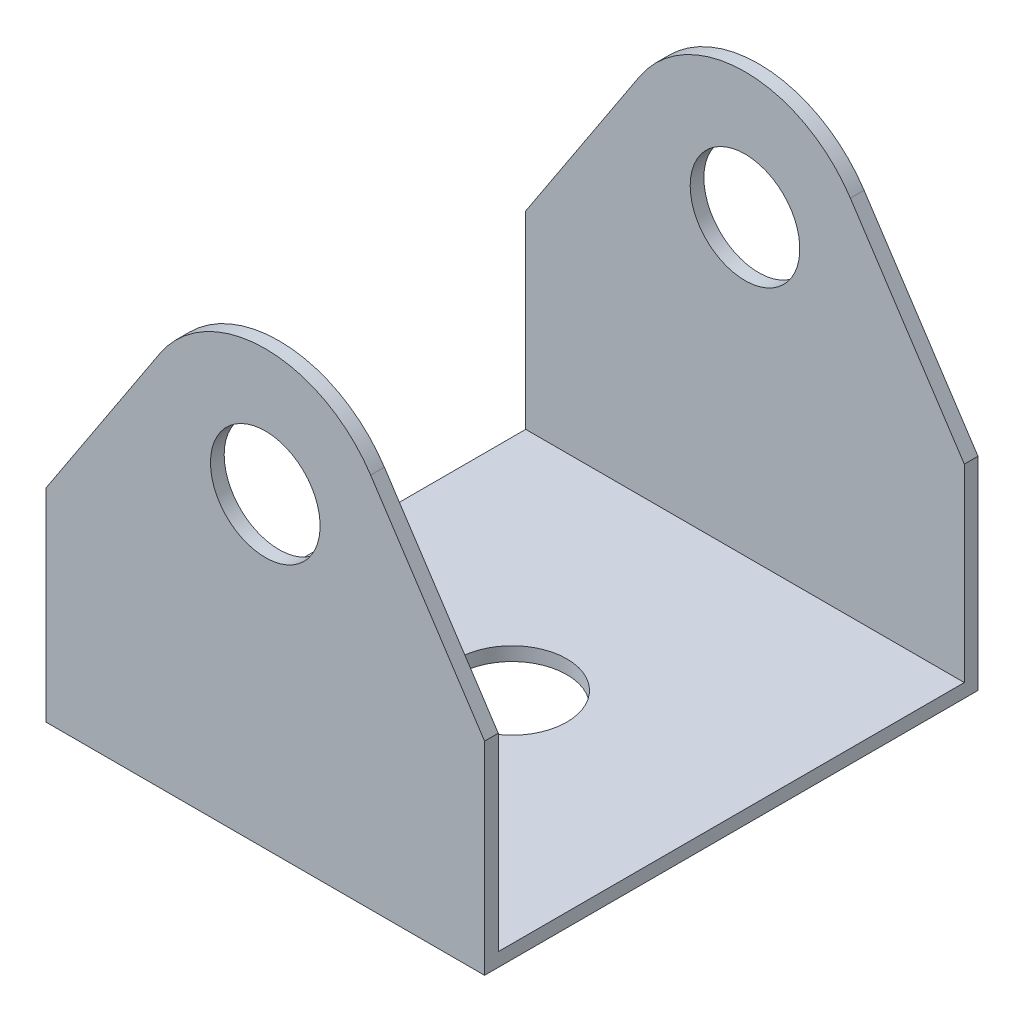
ISO-10303-21;
HEADER;
FILE_DESCRIPTION(('STEP AP214'),'2;1');
FILE_NAME('part.step','',(''),(''),'','','');
FILE_SCHEMA(('AUTOMOTIVE_DESIGN { 1 0 10303 214 1 1 1 1 }'));
ENDSEC;
DATA;
#1=APPLICATION_CONTEXT('core data for automotive mechanical design processes');
#2=APPLICATION_PROTOCOL_DEFINITION('international standard','automotive_design',2000,#1);
#3=PRODUCT_CONTEXT('',#1,'mechanical');
#4=PRODUCT('Part','Part','',(#3));
#5=PRODUCT_RELATED_PRODUCT_CATEGORY('part','',(#4));
#6=PRODUCT_DEFINITION_FORMATION('','',#4);
#7=PRODUCT_DEFINITION_CONTEXT('part definition',#1,'design');
#8=PRODUCT_DEFINITION('design','',#6,#7);
#9=PRODUCT_DEFINITION_SHAPE('','',#8);
#10=(LENGTH_UNIT() NAMED_UNIT(*) SI_UNIT(.MILLI.,.METRE.));
#11=(NAMED_UNIT(*) PLANE_ANGLE_UNIT() SI_UNIT($,.RADIAN.));
#12=(NAMED_UNIT(*) SI_UNIT($,.STERADIAN.) SOLID_ANGLE_UNIT());
#13=UNCERTAINTY_MEASURE_WITH_UNIT(LENGTH_MEASURE(1.E-05),#10,'distance_accuracy_value','');
#14=(GEOMETRIC_REPRESENTATION_CONTEXT(3) GLOBAL_UNCERTAINTY_ASSIGNED_CONTEXT((#13)) GLOBAL_UNIT_ASSIGNED_CONTEXT((#10,
#11,#12)) REPRESENTATION_CONTEXT('',''));
#15=CARTESIAN_POINT('',(0.,0.,0.));
#16=DIRECTION('',(0.,0.,1.));
#17=DIRECTION('',(1.,0.,0.));
#18=AXIS2_PLACEMENT_3D('',#15,#16,#17);
#19=CARTESIAN_POINT('',(40.,-19.,90.));
#20=DIRECTION('',(-0.835794870617099,-0.549041832878103,0.));
#21=DIRECTION('',(0.549041832878103,-0.835794870617099,0.));
#22=AXIS2_PLACEMENT_3D('',#19,#20,#21);
#23=PLANE('',#22);
#24=DIRECTION('',(-0.549041832878103,0.835794870617099,0.));
#25=VECTOR('',#24,1.);
#26=CARTESIAN_POINT('',(40.,-19.,2.5));
#27=LINE('',#26,#25);
#28=CARTESIAN_POINT('',(40.,-19.,2.5));
#29=VERTEX_POINT('',#28);
#30=CARTESIAN_POINT('',(19.2232820241933,12.6279621561964,2.5));
#31=VERTEX_POINT('',#30);
#32=EDGE_CURVE('E152',#29,#31,#27,.T.);
#33=ORIENTED_EDGE('',*,*,#32,.F.);
#34=DIRECTION('',(0.,0.,-1.));
#35=VECTOR('',#34,1.);
#36=CARTESIAN_POINT('',(40.,-19.,90.));
#37=LINE('',#36,#35);
#38=CARTESIAN_POINT('',(40.,-19.,0.));
#39=VERTEX_POINT('',#38);
#40=EDGE_CURVE('E144',#29,#39,#37,.T.);
#41=ORIENTED_EDGE('',*,*,#40,.T.);
#42=DIRECTION('',(-0.549041832878103,0.835794870617099,0.));
#43=VECTOR('',#42,1.);
#44=CARTESIAN_POINT('',(40.,-19.,0.));
#45=LINE('',#44,#43);
#46=CARTESIAN_POINT('',(19.2232820241933,12.6279621561964,0.));
#47=VERTEX_POINT('',#46);
#48=EDGE_CURVE('E161',#39,#47,#45,.T.);
#49=ORIENTED_EDGE('',*,*,#48,.T.);
#50=DIRECTION('',(0.,0.,-1.));
#51=VECTOR('',#50,1.);
#52=CARTESIAN_POINT('',(19.2232820241933,12.6279621561964,90.));
#53=LINE('',#52,#51);
#54=EDGE_CURVE('E40',#31,#47,#53,.T.);
#55=ORIENTED_EDGE('',*,*,#54,.F.);
#56=EDGE_LOOP('',(#33,#41,#49,#55));
#57=FACE_BOUND('',#56,.T.);
#58=ADVANCED_FACE('F31',(#57),#23,.F.);
#59=CARTESIAN_POINT('',(0.,0.,90.));
#60=DIRECTION('',(0.,0.,-1.));
#61=DIRECTION('',(-1.,0.,0.));
#62=AXIS2_PLACEMENT_3D('',#59,#60,#61);
#63=CYLINDRICAL_SURFACE('',#62,23.);
#64=CARTESIAN_POINT('',(0.,0.,2.5));
#65=DIRECTION('',(0.,0.,1.));
#66=DIRECTION('',(1.,0.,0.));
#67=AXIS2_PLACEMENT_3D('',#64,#65,#66);
#68=CIRCLE('',#67,23.);
#69=CARTESIAN_POINT('',(-19.2232820241933,12.6279621561964,2.5));
#70=VERTEX_POINT('',#69);
#71=EDGE_CURVE('E154',#31,#70,#68,.T.);
#72=ORIENTED_EDGE('',*,*,#71,.F.);
#73=ORIENTED_EDGE('',*,*,#54,.T.);
#74=CARTESIAN_POINT('',(0.,0.,0.));
#75=DIRECTION('',(0.,0.,1.));
#76=DIRECTION('',(1.,0.,0.));
#77=AXIS2_PLACEMENT_3D('',#74,#75,#76);
#78=CIRCLE('',#77,23.);
#79=CARTESIAN_POINT('',(-19.2232820241933,12.6279621561964,0.));
#80=VERTEX_POINT('',#79);
#81=EDGE_CURVE('E173',#47,#80,#78,.T.);
#82=ORIENTED_EDGE('',*,*,#81,.T.);
#83=DIRECTION('',(0.,0.,-1.));
#84=VECTOR('',#83,1.);
#85=CARTESIAN_POINT('',(-19.2232820241933,12.6279621561964,90.));
#86=LINE('',#85,#84);
#87=EDGE_CURVE('E209',#70,#80,#86,.T.);
#88=ORIENTED_EDGE('',*,*,#87,.F.);
#89=EDGE_LOOP('',(#72,#73,#82,#88));
#90=FACE_BOUND('',#89,.T.);
#91=ADVANCED_FACE('F261',(#90),#63,.T.);
#92=CARTESIAN_POINT('',(-40.,-19.,90.));
#93=DIRECTION('',(0.835794870617099,-0.549041832878103,0.));
#94=DIRECTION('',(0.549041832878103,0.835794870617099,0.));
#95=AXIS2_PLACEMENT_3D('',#92,#93,#94);
#96=PLANE('',#95);
#97=DIRECTION('',(-0.549041832878103,-0.835794870617099,0.));
#98=VECTOR('',#97,1.);
#99=CARTESIAN_POINT('',(-40.,-19.,2.5));
#100=LINE('',#99,#98);
#101=CARTESIAN_POINT('',(-40.,-19.,2.5));
#102=VERTEX_POINT('',#101);
#103=EDGE_CURVE('E157',#70,#102,#100,.T.);
#104=ORIENTED_EDGE('',*,*,#103,.F.);
#105=ORIENTED_EDGE('',*,*,#87,.T.);
#106=DIRECTION('',(-0.549041832878103,-0.835794870617099,0.));
#107=VECTOR('',#106,1.);
#108=CARTESIAN_POINT('',(-40.,-19.,0.));
#109=LINE('',#108,#107);
#110=CARTESIAN_POINT('',(-40.,-19.,0.));
#111=VERTEX_POINT('',#110);
#112=EDGE_CURVE('E176',#80,#111,#109,.T.);
#113=ORIENTED_EDGE('',*,*,#112,.T.);
#114=DIRECTION('',(0.,0.,-1.));
#115=VECTOR('',#114,1.);
#116=CARTESIAN_POINT('',(-40.,-19.,90.));
#117=LINE('',#116,#115);
#118=EDGE_CURVE('E205',#102,#111,#117,.T.);
#119=ORIENTED_EDGE('',*,*,#118,.F.);
#120=EDGE_LOOP('',(#104,#105,#113,#119));
#121=FACE_BOUND('',#120,.T.);
#122=ADVANCED_FACE('F257',(#121),#96,.F.);
#123=CARTESIAN_POINT('',(-40.,-19.,90.));
#124=DIRECTION('',(1.,0.,0.));
#125=DIRECTION('',(0.,1.,0.));
#126=AXIS2_PLACEMENT_3D('',#123,#124,#125);
#127=PLANE('',#126);
#128=DIRECTION('',(0.,-1.,0.));
#129=VECTOR('',#128,1.);
#130=CARTESIAN_POINT('',(-40.,-19.,2.5));
#131=LINE('',#130,#129);
#132=CARTESIAN_POINT('',(-40.,-53.5,2.5));
#133=VERTEX_POINT('',#132);
#134=EDGE_CURVE('E130',#102,#133,#131,.T.);
#135=ORIENTED_EDGE('',*,*,#134,.F.);
#136=ORIENTED_EDGE('',*,*,#118,.T.);
#137=DIRECTION('',(0.,-1.,0.));
#138=VECTOR('',#137,1.);
#139=CARTESIAN_POINT('',(-40.,-19.,0.));
#140=LINE('',#139,#138);
#141=CARTESIAN_POINT('',(-40.,-56.,0.));
#142=VERTEX_POINT('',#141);
#143=EDGE_CURVE('E179',#111,#142,#140,.T.);
#144=ORIENTED_EDGE('',*,*,#143,.T.);
#145=DIRECTION('',(0.,0.,-1.));
#146=VECTOR('',#145,1.);
#147=CARTESIAN_POINT('',(-40.,-56.,90.));
#148=LINE('',#147,#146);
#149=CARTESIAN_POINT('',(-40.,-56.,90.));
#150=VERTEX_POINT('',#149);
#151=EDGE_CURVE('E202',#150,#142,#148,.T.);
#152=ORIENTED_EDGE('',*,*,#151,.F.);
#153=DIRECTION('',(0.,-1.,0.));
#154=VECTOR('',#153,1.);
#155=CARTESIAN_POINT('',(-40.,-19.,90.));
#156=LINE('',#155,#154);
#157=CARTESIAN_POINT('',(-40.,-19.,90.));
#158=VERTEX_POINT('',#157);
#159=EDGE_CURVE('E191',#158,#150,#156,.T.);
#160=ORIENTED_EDGE('',*,*,#159,.F.);
#161=CARTESIAN_POINT('',(-40.,-19.,87.5));
#162=VERTEX_POINT('',#161);
#163=EDGE_CURVE('E206',#158,#162,#117,.T.);
#164=ORIENTED_EDGE('',*,*,#163,.T.);
#165=DIRECTION('',(0.,-1.,0.));
#166=VECTOR('',#165,1.);
#167=CARTESIAN_POINT('',(-40.,-19.,87.5));
#168=LINE('',#167,#166);
#169=CARTESIAN_POINT('',(-40.,-53.5,87.5));
#170=VERTEX_POINT('',#169);
#171=EDGE_CURVE('E162',#162,#170,#168,.T.);
#172=ORIENTED_EDGE('',*,*,#171,.T.);
#173=DIRECTION('',(0.,0.,-1.));
#174=VECTOR('',#173,1.);
#175=CARTESIAN_POINT('',(-40.,-53.5,90.));
#176=LINE('',#175,#174);
#177=EDGE_CURVE('E139',#170,#133,#176,.T.);
#178=ORIENTED_EDGE('',*,*,#177,.T.);
#179=EDGE_LOOP('',(#135,#136,#144,#152,#160,#164,#172,#178));
#180=FACE_BOUND('',#179,.T.);
#181=ADVANCED_FACE('F252',(#180),#127,.F.);
#182=CARTESIAN_POINT('',(40.,-19.,90.));
#183=DIRECTION('',(-1.,0.,0.));
#184=DIRECTION('',(0.,-1.,0.));
#185=AXIS2_PLACEMENT_3D('',#182,#183,#184);
#186=PLANE('',#185);
#187=DIRECTION('',(0.,1.,0.));
#188=VECTOR('',#187,1.);
#189=CARTESIAN_POINT('',(40.,-19.,2.5));
#190=LINE('',#189,#188);
#191=CARTESIAN_POINT('',(40.,-53.5,2.5));
#192=VERTEX_POINT('',#191);
#193=EDGE_CURVE('E127',#192,#29,#190,.T.);
#194=ORIENTED_EDGE('',*,*,#193,.F.);
#195=DIRECTION('',(0.,0.,-1.));
#196=VECTOR('',#195,1.);
#197=CARTESIAN_POINT('',(40.,-53.5,90.));
#198=LINE('',#197,#196);
#199=CARTESIAN_POINT('',(40.,-53.5,87.5));
#200=VERTEX_POINT('',#199);
#201=EDGE_CURVE('E135',#200,#192,#198,.T.);
#202=ORIENTED_EDGE('',*,*,#201,.F.);
#203=DIRECTION('',(0.,1.,0.));
#204=VECTOR('',#203,1.);
#205=CARTESIAN_POINT('',(40.,-19.,87.5));
#206=LINE('',#205,#204);
#207=CARTESIAN_POINT('',(40.,-19.,87.5));
#208=VERTEX_POINT('',#207);
#209=EDGE_CURVE('E48',#200,#208,#206,.T.);
#210=ORIENTED_EDGE('',*,*,#209,.T.);
#211=CARTESIAN_POINT('',(40.,-19.,90.));
#212=VERTEX_POINT('',#211);
#213=EDGE_CURVE('E196',#212,#208,#37,.T.);
#214=ORIENTED_EDGE('',*,*,#213,.F.);
#215=DIRECTION('',(0.,1.,0.));
#216=VECTOR('',#215,1.);
#217=CARTESIAN_POINT('',(40.,-19.,90.));
#218=LINE('',#217,#216);
#219=CARTESIAN_POINT('',(40.,-56.,90.));
#220=VERTEX_POINT('',#219);
#221=EDGE_CURVE('E56',#220,#212,#218,.T.);
#222=ORIENTED_EDGE('',*,*,#221,.F.);
#223=DIRECTION('',(0.,0.,-1.));
#224=VECTOR('',#223,1.);
#225=CARTESIAN_POINT('',(40.,-56.,90.));
#226=LINE('',#225,#224);
#227=CARTESIAN_POINT('',(40.,-56.,0.));
#228=VERTEX_POINT('',#227);
#229=EDGE_CURVE('E199',#220,#228,#226,.T.);
#230=ORIENTED_EDGE('',*,*,#229,.T.);
#231=DIRECTION('',(0.,1.,0.));
#232=VECTOR('',#231,1.);
#233=CARTESIAN_POINT('',(40.,-19.,0.));
#234=LINE('',#233,#232);
#235=EDGE_CURVE('E183',#228,#39,#234,.T.);
#236=ORIENTED_EDGE('',*,*,#235,.T.);
#237=ORIENTED_EDGE('',*,*,#40,.F.);
#238=EDGE_LOOP('',(#194,#202,#210,#214,#222,#230,#236,#237));
#239=FACE_BOUND('',#238,.T.);
#240=ADVANCED_FACE('F142',(#239),#186,.F.);
#241=ORIENTED_EDGE('',*,*,#213,.T.);
#242=DIRECTION('',(-0.549041832878103,0.835794870617099,0.));
#243=VECTOR('',#242,1.);
#244=CARTESIAN_POINT('',(40.,-19.,87.5));
#245=LINE('',#244,#243);
#246=CARTESIAN_POINT('',(19.2232820241933,12.6279621561964,87.5));
#247=VERTEX_POINT('',#246);
#248=EDGE_CURVE('E145',#208,#247,#245,.T.);
#249=ORIENTED_EDGE('',*,*,#248,.T.);
#250=CARTESIAN_POINT('',(19.2232820241933,12.6279621561964,90.));
#251=VERTEX_POINT('',#250);
#252=EDGE_CURVE('E11',#251,#247,#53,.T.);
#253=ORIENTED_EDGE('',*,*,#252,.F.);
#254=DIRECTION('',(-0.549041832878103,0.835794870617099,0.));
#255=VECTOR('',#254,1.);
#256=CARTESIAN_POINT('',(40.,-19.,90.));
#257=LINE('',#256,#255);
#258=EDGE_CURVE('E185',#212,#251,#257,.T.);
#259=ORIENTED_EDGE('',*,*,#258,.F.);
#260=EDGE_LOOP('',(#241,#249,#253,#259));
#261=FACE_BOUND('',#260,.T.);
#262=ADVANCED_FACE('F33',(#261),#23,.F.);
#263=ORIENTED_EDGE('',*,*,#252,.T.);
#264=CARTESIAN_POINT('',(0.,0.,87.5));
#265=DIRECTION('',(0.,0.,1.));
#266=DIRECTION('',(1.,0.,0.));
#267=AXIS2_PLACEMENT_3D('',#264,#265,#266);
#268=CIRCLE('',#267,23.);
#269=CARTESIAN_POINT('',(-19.2232820241933,12.6279621561964,87.5));
#270=VERTEX_POINT('',#269);
#271=EDGE_CURVE('E148',#247,#270,#268,.T.);
#272=ORIENTED_EDGE('',*,*,#271,.T.);
#273=CARTESIAN_POINT('',(-19.2232820241933,12.6279621561964,90.));
#274=VERTEX_POINT('',#273);
#275=EDGE_CURVE('E210',#274,#270,#86,.T.);
#276=ORIENTED_EDGE('',*,*,#275,.F.);
#277=CARTESIAN_POINT('',(0.,0.,90.));
#278=DIRECTION('',(0.,0.,1.));
#279=DIRECTION('',(1.,0.,0.));
#280=AXIS2_PLACEMENT_3D('',#277,#278,#279);
#281=CIRCLE('',#280,23.);
#282=EDGE_CURVE('E187',#251,#274,#281,.T.);
#283=ORIENTED_EDGE('',*,*,#282,.F.);
#284=EDGE_LOOP('',(#263,#272,#276,#283));
#285=FACE_BOUND('',#284,.T.);
#286=ADVANCED_FACE('F263',(#285),#63,.T.);
#287=ORIENTED_EDGE('',*,*,#275,.T.);
#288=DIRECTION('',(-0.549041832878103,-0.835794870617099,0.));
#289=VECTOR('',#288,1.);
#290=CARTESIAN_POINT('',(-40.,-19.,87.5));
#291=LINE('',#290,#289);
#292=EDGE_CURVE('E165',#270,#162,#291,.T.);
#293=ORIENTED_EDGE('',*,*,#292,.T.);
#294=ORIENTED_EDGE('',*,*,#163,.F.);
#295=DIRECTION('',(-0.549041832878103,-0.835794870617099,0.));
#296=VECTOR('',#295,1.);
#297=CARTESIAN_POINT('',(-40.,-19.,90.));
#298=LINE('',#297,#296);
#299=EDGE_CURVE('E189',#274,#158,#298,.T.);
#300=ORIENTED_EDGE('',*,*,#299,.F.);
#301=EDGE_LOOP('',(#287,#293,#294,#300));
#302=FACE_BOUND('',#301,.T.);
#303=ADVANCED_FACE('F269',(#302),#96,.F.);
#304=CARTESIAN_POINT('',(40.,-56.,90.));
#305=DIRECTION('',(0.,1.,0.));
#306=DIRECTION('',(0.,0.,1.));
#307=AXIS2_PLACEMENT_3D('',#304,#305,#306);
#308=PLANE('',#307);
#309=CARTESIAN_POINT('',(0.,-56.,45.));
#310=DIRECTION('',(0.,-1.,0.));
#311=DIRECTION('',(0.,0.,-1.));
#312=AXIS2_PLACEMENT_3D('',#309,#310,#311);
#313=CIRCLE('',#312,10.);
#314=CARTESIAN_POINT('',(0.,-56.,35.));
#315=VERTEX_POINT('',#314);
#316=EDGE_CURVE('E213',#315,#315,#313,.T.);
#317=ORIENTED_EDGE('',*,*,#316,.F.);
#318=EDGE_LOOP('',(#317));
#319=FACE_BOUND('',#318,.T.);
#320=DIRECTION('',(1.,0.,0.));
#321=VECTOR('',#320,1.);
#322=CARTESIAN_POINT('',(40.,-56.,0.));
#323=LINE('',#322,#321);
#324=EDGE_CURVE('E181',#142,#228,#323,.T.);
#325=ORIENTED_EDGE('',*,*,#324,.T.);
#326=ORIENTED_EDGE('',*,*,#229,.F.);
#327=DIRECTION('',(1.,0.,0.));
#328=VECTOR('',#327,1.);
#329=CARTESIAN_POINT('',(40.,-56.,90.));
#330=LINE('',#329,#328);
#331=EDGE_CURVE('E193',#150,#220,#330,.T.);
#332=ORIENTED_EDGE('',*,*,#331,.F.);
#333=ORIENTED_EDGE('',*,*,#151,.T.);
#334=EDGE_LOOP('',(#325,#326,#332,#333));
#335=FACE_BOUND('',#334,.T.);
#336=ADVANCED_FACE('F248',(#319,#335),#308,.F.);
#337=CARTESIAN_POINT('',(0.,0.,90.));
#338=DIRECTION('',(0.,0.,1.));
#339=DIRECTION('',(1.,0.,0.));
#340=AXIS2_PLACEMENT_3D('',#337,#338,#339);
#341=PLANE('',#340);
#342=CARTESIAN_POINT('',(0.,0.,90.));
#343=DIRECTION('',(0.,0.,-1.));
#344=DIRECTION('',(-1.,0.,0.));
#345=AXIS2_PLACEMENT_3D('',#342,#343,#344);
#346=CIRCLE('',#345,10.);
#347=CARTESIAN_POINT('',(-10.,0.,90.));
#348=VERTEX_POINT('',#347);
#349=EDGE_CURVE('E224',#348,#348,#346,.T.);
#350=ORIENTED_EDGE('',*,*,#349,.T.);
#351=EDGE_LOOP('',(#350));
#352=FACE_BOUND('',#351,.T.);
#353=ORIENTED_EDGE('',*,*,#258,.T.);
#354=ORIENTED_EDGE('',*,*,#282,.T.);
#355=ORIENTED_EDGE('',*,*,#299,.T.);
#356=ORIENTED_EDGE('',*,*,#159,.T.);
#357=ORIENTED_EDGE('',*,*,#331,.T.);
#358=ORIENTED_EDGE('',*,*,#221,.T.);
#359=EDGE_LOOP('',(#353,#354,#355,#356,#357,#358));
#360=FACE_BOUND('',#359,.T.);
#361=ADVANCED_FACE('F236',(#352,#360),#341,.T.);
#362=CARTESIAN_POINT('',(0.,0.,0.));
#363=DIRECTION('',(0.,0.,1.));
#364=DIRECTION('',(1.,0.,0.));
#365=AXIS2_PLACEMENT_3D('',#362,#363,#364);
#366=PLANE('',#365);
#367=CARTESIAN_POINT('',(0.,0.,0.));
#368=DIRECTION('',(0.,0.,-1.));
#369=DIRECTION('',(-1.,0.,0.));
#370=AXIS2_PLACEMENT_3D('',#367,#368,#369);
#371=CIRCLE('',#370,10.);
#372=CARTESIAN_POINT('',(-10.,0.,0.));
#373=VERTEX_POINT('',#372);
#374=EDGE_CURVE('E227',#373,#373,#371,.T.);
#375=ORIENTED_EDGE('',*,*,#374,.F.);
#376=EDGE_LOOP('',(#375));
#377=FACE_BOUND('',#376,.T.);
#378=ORIENTED_EDGE('',*,*,#48,.F.);
#379=ORIENTED_EDGE('',*,*,#235,.F.);
#380=ORIENTED_EDGE('',*,*,#324,.F.);
#381=ORIENTED_EDGE('',*,*,#143,.F.);
#382=ORIENTED_EDGE('',*,*,#112,.F.);
#383=ORIENTED_EDGE('',*,*,#81,.F.);
#384=EDGE_LOOP('',(#378,#379,#380,#381,#382,#383));
#385=FACE_BOUND('',#384,.T.);
#386=ADVANCED_FACE('F233',(#377,#385),#366,.F.);
#387=CARTESIAN_POINT('',(40.,-53.5,90.));
#388=DIRECTION('',(0.,1.,0.));
#389=DIRECTION('',(0.,0.,1.));
#390=AXIS2_PLACEMENT_3D('',#387,#388,#389);
#391=PLANE('',#390);
#392=CARTESIAN_POINT('',(0.,-53.5,45.));
#393=DIRECTION('',(0.,1.,0.));
#394=DIRECTION('',(0.,0.,1.));
#395=AXIS2_PLACEMENT_3D('',#392,#393,#394);
#396=CIRCLE('',#395,10.);
#397=CARTESIAN_POINT('',(0.,-53.5,35.));
#398=VERTEX_POINT('',#397);
#399=EDGE_CURVE('E155',#398,#398,#396,.T.);
#400=ORIENTED_EDGE('',*,*,#399,.F.);
#401=EDGE_LOOP('',(#400));
#402=FACE_BOUND('',#401,.T.);
#403=DIRECTION('',(1.,0.,0.));
#404=VECTOR('',#403,1.);
#405=CARTESIAN_POINT('',(40.,-53.5,2.5));
#406=LINE('',#405,#404);
#407=EDGE_CURVE('E123',#133,#192,#406,.T.);
#408=ORIENTED_EDGE('',*,*,#407,.F.);
#409=ORIENTED_EDGE('',*,*,#177,.F.);
#410=DIRECTION('',(1.,0.,0.));
#411=VECTOR('',#410,1.);
#412=CARTESIAN_POINT('',(40.,-53.5,87.5));
#413=LINE('',#412,#411);
#414=EDGE_CURVE('E137',#170,#200,#413,.T.);
#415=ORIENTED_EDGE('',*,*,#414,.T.);
#416=ORIENTED_EDGE('',*,*,#201,.T.);
#417=EDGE_LOOP('',(#408,#409,#415,#416));
#418=FACE_BOUND('',#417,.T.);
#419=ADVANCED_FACE('F136',(#402,#418),#391,.T.);
#420=CARTESIAN_POINT('',(0.,0.,87.5));
#421=DIRECTION('',(0.,0.,1.));
#422=DIRECTION('',(1.,0.,0.));
#423=AXIS2_PLACEMENT_3D('',#420,#421,#422);
#424=PLANE('',#423);
#425=CARTESIAN_POINT('',(0.,0.,87.5));
#426=DIRECTION('',(0.,0.,1.));
#427=DIRECTION('',(1.,0.,0.));
#428=AXIS2_PLACEMENT_3D('',#425,#426,#427);
#429=CIRCLE('',#428,10.);
#430=CARTESIAN_POINT('',(-10.,0.,87.5));
#431=VERTEX_POINT('',#430);
#432=EDGE_CURVE('E217',#431,#431,#429,.T.);
#433=ORIENTED_EDGE('',*,*,#432,.T.);
#434=EDGE_LOOP('',(#433));
#435=FACE_BOUND('',#434,.T.);
#436=ORIENTED_EDGE('',*,*,#248,.F.);
#437=ORIENTED_EDGE('',*,*,#209,.F.);
#438=ORIENTED_EDGE('',*,*,#414,.F.);
#439=ORIENTED_EDGE('',*,*,#171,.F.);
#440=ORIENTED_EDGE('',*,*,#292,.F.);
#441=ORIENTED_EDGE('',*,*,#271,.F.);
#442=EDGE_LOOP('',(#436,#437,#438,#439,#440,#441));
#443=FACE_BOUND('',#442,.T.);
#444=ADVANCED_FACE('F281',(#435,#443),#424,.F.);
#445=CARTESIAN_POINT('',(0.,0.,2.5));
#446=DIRECTION('',(0.,0.,1.));
#447=DIRECTION('',(1.,0.,0.));
#448=AXIS2_PLACEMENT_3D('',#445,#446,#447);
#449=PLANE('',#448);
#450=CARTESIAN_POINT('',(0.,0.,2.5));
#451=DIRECTION('',(0.,0.,1.));
#452=DIRECTION('',(1.,0.,0.));
#453=AXIS2_PLACEMENT_3D('',#450,#451,#452);
#454=CIRCLE('',#453,10.);
#455=CARTESIAN_POINT('',(-10.,0.,2.49999999999999));
#456=VERTEX_POINT('',#455);
#457=EDGE_CURVE('E35',#456,#456,#454,.T.);
#458=ORIENTED_EDGE('',*,*,#457,.F.);
#459=EDGE_LOOP('',(#458));
#460=FACE_BOUND('',#459,.T.);
#461=ORIENTED_EDGE('',*,*,#32,.T.);
#462=ORIENTED_EDGE('',*,*,#71,.T.);
#463=ORIENTED_EDGE('',*,*,#103,.T.);
#464=ORIENTED_EDGE('',*,*,#134,.T.);
#465=ORIENTED_EDGE('',*,*,#407,.T.);
#466=ORIENTED_EDGE('',*,*,#193,.T.);
#467=EDGE_LOOP('',(#461,#462,#463,#464,#465,#466));
#468=FACE_BOUND('',#467,.T.);
#469=ADVANCED_FACE('F125',(#460,#468),#449,.T.);
#470=CARTESIAN_POINT('',(0.,34.,45.));
#471=DIRECTION('',(0.,-1.,0.));
#472=DIRECTION('',(0.,0.,-1.));
#473=AXIS2_PLACEMENT_3D('',#470,#471,#472);
#474=CYLINDRICAL_SURFACE('',#473,10.);
#475=CARTESIAN_POINT('',(0.,-53.5,35.));
#476=CARTESIAN_POINT('',(0.,-53.5260416666667,35.));
#477=CARTESIAN_POINT('',(0.,-53.5520833333333,35.));
#478=CARTESIAN_POINT('',(0.,-53.6041666666667,35.));
#479=CARTESIAN_POINT('',(0.,-53.6302083333333,35.));
#480=CARTESIAN_POINT('',(0.,-53.6822916666667,35.));
#481=CARTESIAN_POINT('',(0.,-53.7083333333333,35.));
#482=CARTESIAN_POINT('',(0.,-53.7604166666667,35.));
#483=CARTESIAN_POINT('',(0.,-53.7864583333333,35.));
#484=CARTESIAN_POINT('',(0.,-53.8385416666667,35.));
#485=CARTESIAN_POINT('',(0.,-53.8645833333333,35.));
#486=CARTESIAN_POINT('',(0.,-53.9166666666667,35.));
#487=CARTESIAN_POINT('',(0.,-53.9427083333333,35.));
#488=CARTESIAN_POINT('',(0.,-53.9947916666667,35.));
#489=CARTESIAN_POINT('',(0.,-54.0208333333333,35.));
#490=CARTESIAN_POINT('',(0.,-54.0729166666667,35.));
#491=CARTESIAN_POINT('',(0.,-54.0989583333333,35.));
#492=CARTESIAN_POINT('',(0.,-54.1510416666667,35.));
#493=CARTESIAN_POINT('',(0.,-54.1770833333333,35.));
#494=CARTESIAN_POINT('',(0.,-54.2291666666667,35.));
#495=CARTESIAN_POINT('',(0.,-54.2552083333333,35.));
#496=CARTESIAN_POINT('',(0.,-54.3072916666667,35.));
#497=CARTESIAN_POINT('',(0.,-54.3333333333333,35.));
#498=CARTESIAN_POINT('',(0.,-54.3854166666667,35.));
#499=CARTESIAN_POINT('',(0.,-54.4114583333333,35.));
#500=CARTESIAN_POINT('',(0.,-54.4635416666667,35.));
#501=CARTESIAN_POINT('',(0.,-54.4895833333333,35.));
#502=CARTESIAN_POINT('',(0.,-54.5416666666667,35.));
#503=CARTESIAN_POINT('',(0.,-54.5677083333333,35.));
#504=CARTESIAN_POINT('',(0.,-54.6197916666667,35.));
#505=CARTESIAN_POINT('',(0.,-54.6458333333333,35.));
#506=CARTESIAN_POINT('',(0.,-54.6979166666667,35.));
#507=CARTESIAN_POINT('',(0.,-54.7239583333333,35.));
#508=CARTESIAN_POINT('',(0.,-54.7760416666667,35.));
#509=CARTESIAN_POINT('',(0.,-54.8020833333333,35.));
#510=CARTESIAN_POINT('',(0.,-54.8541666666667,35.));
#511=CARTESIAN_POINT('',(0.,-54.8802083333333,35.));
#512=CARTESIAN_POINT('',(0.,-54.9322916666667,35.));
#513=CARTESIAN_POINT('',(0.,-54.9583333333333,35.));
#514=CARTESIAN_POINT('',(0.,-55.0104166666667,35.));
#515=CARTESIAN_POINT('',(0.,-55.0364583333333,35.));
#516=CARTESIAN_POINT('',(0.,-55.0885416666667,35.));
#517=CARTESIAN_POINT('',(0.,-55.1145833333333,35.));
#518=CARTESIAN_POINT('',(0.,-55.1666666666667,35.));
#519=CARTESIAN_POINT('',(0.,-55.1927083333333,35.));
#520=CARTESIAN_POINT('',(0.,-55.2447916666667,35.));
#521=CARTESIAN_POINT('',(0.,-55.2708333333333,35.));
#522=CARTESIAN_POINT('',(0.,-55.3229166666667,35.));
#523=CARTESIAN_POINT('',(0.,-55.3489583333333,35.));
#524=CARTESIAN_POINT('',(0.,-55.4010416666667,35.));
#525=CARTESIAN_POINT('',(0.,-55.4270833333333,35.));
#526=CARTESIAN_POINT('',(0.,-55.4791666666667,35.));
#527=CARTESIAN_POINT('',(0.,-55.5052083333333,35.));
#528=CARTESIAN_POINT('',(0.,-55.5572916666667,35.));
#529=CARTESIAN_POINT('',(0.,-55.5833333333333,35.));
#530=CARTESIAN_POINT('',(0.,-55.6354166666667,35.));
#531=CARTESIAN_POINT('',(0.,-55.6614583333333,35.));
#532=CARTESIAN_POINT('',(0.,-55.7135416666667,35.));
#533=CARTESIAN_POINT('',(0.,-55.7395833333333,35.));
#534=CARTESIAN_POINT('',(0.,-55.7916666666667,35.));
#535=CARTESIAN_POINT('',(0.,-55.8177083333333,35.));
#536=CARTESIAN_POINT('',(0.,-55.8697916666667,35.));
#537=CARTESIAN_POINT('',(0.,-55.8958333333333,35.));
#538=CARTESIAN_POINT('',(0.,-55.9479166666667,35.));
#539=CARTESIAN_POINT('',(0.,-55.9739583333333,35.));
#540=CARTESIAN_POINT('',(0.,-56.,35.));
#541=B_SPLINE_CURVE_WITH_KNOTS('',3,(#475,#476,#477,#478,#479,#480,#481,#482,#483,#484,#485,
#486,#487,#488,#489,#490,#491,#492,#493,#494,#495,#496,#497,#498,#499,#500,#501,#502,#503,#504,
#505,#506,#507,#508,#509,#510,#511,#512,#513,#514,#515,#516,#517,#518,#519,#520,#521,#522,#523,
#524,#525,#526,#527,#528,#529,#530,#531,#532,#533,#534,#535,#536,#537,#538,#539,#540),
.UNSPECIFIED.,.F.,.F.,(4,2,2,2,2,2,2,2,2,2,2,2,2,2,2,2,2,2,2,2,2,2,2,2,2,2,2,2,2,2,2,2,4),(0.,
0.0781249999999983,0.156249999999997,0.234374999999995,0.312499999999993,0.390625000000006,
0.468750000000004,0.546875000000002,0.625000000000001,0.703124999999999,0.781249999999997,
0.859374999999996,0.937500000000008,1.01562500000001,1.09375,1.171875,1.25,1.328125,1.40625,
1.484375,1.56249999999999,1.64062500000001,1.71875,1.796875,1.875,1.953125,2.03125,2.109375,
2.18750000000001,2.26562500000001,2.34375000000001,2.421875,2.5),.UNSPECIFIED.);
#542=EDGE_CURVE('BSEAM341',#398,#315,#541,.T.);
#543=ORIENTED_EDGE('',*,*,#399,.T.);
#544=ORIENTED_EDGE('',*,*,#316,.T.);
#545=ORIENTED_EDGE('',*,*,#542,.T.);
#546=ORIENTED_EDGE('',*,*,#542,.F.);
#547=EDGE_LOOP('',(#543,#545,#544,#546));
#548=FACE_BOUND('',#547,.T.);
#549=ADVANCED_FACE('F341',(#548),#474,.F.);
#550=CARTESIAN_POINT('',(0.,0.,90.));
#551=DIRECTION('',(0.,0.,-1.));
#552=DIRECTION('',(-1.,0.,0.));
#553=AXIS2_PLACEMENT_3D('',#550,#551,#552);
#554=CYLINDRICAL_SURFACE('',#553,10.);
#555=CARTESIAN_POINT('',(-10.,0.,2.49999999999999));
#556=CARTESIAN_POINT('',(-10.,0.,2.47395833333332));
#557=CARTESIAN_POINT('',(-10.,0.,2.44791666666666));
#558=CARTESIAN_POINT('',(-10.,0.,2.39583333333332));
#559=CARTESIAN_POINT('',(-10.,0.,2.36979166666666));
#560=CARTESIAN_POINT('',(-10.,0.,2.31770833333333));
#561=CARTESIAN_POINT('',(-10.,0.,2.29166666666666));
#562=CARTESIAN_POINT('',(-10.,0.,2.23958333333333));
#563=CARTESIAN_POINT('',(-10.,0.,2.21354166666666));
#564=CARTESIAN_POINT('',(-10.,0.,2.16145833333333));
#565=CARTESIAN_POINT('',(-10.,0.,2.13541666666666));
#566=CARTESIAN_POINT('',(-10.,0.,2.08333333333333));
#567=CARTESIAN_POINT('',(-10.,0.,2.05729166666666));
#568=CARTESIAN_POINT('',(-10.,0.,2.00520833333333));
#569=CARTESIAN_POINT('',(-10.,0.,1.97916666666667));
#570=CARTESIAN_POINT('',(-10.,0.,1.92708333333333));
#571=CARTESIAN_POINT('',(-10.,0.,1.90104166666667));
#572=CARTESIAN_POINT('',(-10.,0.,1.84895833333333));
#573=CARTESIAN_POINT('',(-10.,0.,1.82291666666666));
#574=CARTESIAN_POINT('',(-10.,0.,1.77083333333332));
#575=CARTESIAN_POINT('',(-10.,0.,1.74479166666666));
#576=CARTESIAN_POINT('',(-10.,0.,1.69270833333333));
#577=CARTESIAN_POINT('',(-10.,0.,1.66666666666666));
#578=CARTESIAN_POINT('',(-10.,0.,1.61458333333333));
#579=CARTESIAN_POINT('',(-10.,0.,1.58854166666666));
#580=CARTESIAN_POINT('',(-10.,0.,1.53645833333333));
#581=CARTESIAN_POINT('',(-10.,0.,1.51041666666666));
#582=CARTESIAN_POINT('',(-10.,0.,1.45833333333333));
#583=CARTESIAN_POINT('',(-10.,0.,1.43229166666666));
#584=CARTESIAN_POINT('',(-10.,0.,1.38020833333333));
#585=CARTESIAN_POINT('',(-10.,0.,1.35416666666667));
#586=CARTESIAN_POINT('',(-10.,0.,1.30208333333333));
#587=CARTESIAN_POINT('',(-10.,0.,1.27604166666667));
#588=CARTESIAN_POINT('',(-10.,0.,1.22395833333334));
#589=CARTESIAN_POINT('',(-10.,0.,1.19791666666667));
#590=CARTESIAN_POINT('',(-10.,0.,1.14583333333334));
#591=CARTESIAN_POINT('',(-10.,0.,1.11979166666667));
#592=CARTESIAN_POINT('',(-10.,0.,1.06770833333334));
#593=CARTESIAN_POINT('',(-10.,0.,1.04166666666667));
#594=CARTESIAN_POINT('',(-10.,0.,0.98958333333334));
#595=CARTESIAN_POINT('',(-10.,0.,0.963541666666674));
#596=CARTESIAN_POINT('',(-10.,0.,0.911458333333342));
#597=CARTESIAN_POINT('',(-10.,0.,0.885416666666676));
#598=CARTESIAN_POINT('',(-10.,0.,0.833333333333343));
#599=CARTESIAN_POINT('',(-10.,0.,0.807291666666677));
#600=CARTESIAN_POINT('',(-10.,0.,0.755208333333345));
#601=CARTESIAN_POINT('',(-10.,0.,0.729166666666679));
#602=CARTESIAN_POINT('',(-10.,0.,0.677083333333342));
#603=CARTESIAN_POINT('',(-10.,0.,0.651041666666671));
#604=CARTESIAN_POINT('',(-10.,0.,0.598958333333334));
#605=CARTESIAN_POINT('',(-10.,0.,0.572916666666668));
#606=CARTESIAN_POINT('',(-10.,0.,0.520833333333336));
#607=CARTESIAN_POINT('',(-10.,0.,0.49479166666667));
#608=CARTESIAN_POINT('',(-10.,0.,0.442708333333338));
#609=CARTESIAN_POINT('',(-10.,0.,0.416666666666672));
#610=CARTESIAN_POINT('',(-10.,0.,0.364583333333339));
#611=CARTESIAN_POINT('',(-10.,0.,0.338541666666673));
#612=CARTESIAN_POINT('',(-10.,0.,0.286458333333341));
#613=CARTESIAN_POINT('',(-10.,0.,0.260416666666675));
#614=CARTESIAN_POINT('',(-10.,0.,0.208333333333343));
#615=CARTESIAN_POINT('',(-10.,0.,0.182291666666677));
#616=CARTESIAN_POINT('',(-10.,0.,0.130208333333344));
#617=CARTESIAN_POINT('',(-10.,0.,0.104166666666678));
#618=CARTESIAN_POINT('',(-10.,0.,0.0520833333333461));
#619=CARTESIAN_POINT('',(-10.,0.,0.02604166666668));
#620=CARTESIAN_POINT('',(-10.,0.,0.));
#621=B_SPLINE_CURVE_WITH_KNOTS('',3,(#555,#556,#557,#558,#559,#560,#561,#562,#563,#564,#565,
#566,#567,#568,#569,#570,#571,#572,#573,#574,#575,#576,#577,#578,#579,#580,#581,#582,#583,#584,
#585,#586,#587,#588,#589,#590,#591,#592,#593,#594,#595,#596,#597,#598,#599,#600,#601,#602,#603,
#604,#605,#606,#607,#608,#609,#610,#611,#612,#613,#614,#615,#616,#617,#618,#619,#620),
.UNSPECIFIED.,.F.,.F.,(4,2,2,2,2,2,2,2,2,2,2,2,2,2,2,2,2,2,2,2,2,2,2,2,2,2,2,2,2,2,2,2,4),(0.,
0.0781249999999983,0.156249999999997,0.234374999999995,0.312499999999993,0.390624999999992,
0.46874999999999,0.546874999999988,0.624999999999987,0.703124999999999,0.781249999999997,
0.859374999999996,0.937499999999994,1.01562499999999,1.09374999999999,1.17187499999999,
1.24999999999999,1.32812499999999,1.40624999999998,1.48437499999998,1.56249999999998,
1.64062499999998,1.71874999999998,1.79687499999998,1.87499999999999,1.95312499999999,
2.03124999999998,2.10937499999998,2.18749999999998,2.26562499999998,2.34374999999998,
2.42187499999998,2.49999999999997),.UNSPECIFIED.);
#622=EDGE_CURVE('BSEAM231',#456,#373,#621,.T.);
#623=ORIENTED_EDGE('',*,*,#457,.T.);
#624=ORIENTED_EDGE('',*,*,#374,.T.);
#625=ORIENTED_EDGE('',*,*,#622,.T.);
#626=ORIENTED_EDGE('',*,*,#622,.F.);
#627=EDGE_LOOP('',(#623,#625,#624,#626));
#628=FACE_BOUND('',#627,.T.);
#629=ADVANCED_FACE('F231',(#628),#554,.F.);
#630=CARTESIAN_POINT('',(-10.,0.,90.));
#631=CARTESIAN_POINT('',(-10.,0.,89.9739583333333));
#632=CARTESIAN_POINT('',(-10.,0.,89.9479166666667));
#633=CARTESIAN_POINT('',(-10.,0.,89.8958333333333));
#634=CARTESIAN_POINT('',(-10.,0.,89.8697916666667));
#635=CARTESIAN_POINT('',(-10.,0.,89.8177083333333));
#636=CARTESIAN_POINT('',(-10.,0.,89.7916666666667));
#637=CARTESIAN_POINT('',(-10.,0.,89.7395833333333));
#638=CARTESIAN_POINT('',(-10.,0.,89.7135416666667));
#639=CARTESIAN_POINT('',(-10.,0.,89.6614583333333));
#640=CARTESIAN_POINT('',(-10.,0.,89.6354166666667));
#641=CARTESIAN_POINT('',(-10.,0.,89.5833333333333));
#642=CARTESIAN_POINT('',(-10.,0.,89.5572916666667));
#643=CARTESIAN_POINT('',(-10.,0.,89.5052083333333));
#644=CARTESIAN_POINT('',(-10.,0.,89.4791666666667));
#645=CARTESIAN_POINT('',(-10.,0.,89.4270833333333));
#646=CARTESIAN_POINT('',(-10.,0.,89.4010416666667));
#647=CARTESIAN_POINT('',(-10.,0.,89.3489583333333));
#648=CARTESIAN_POINT('',(-10.,0.,89.3229166666667));
#649=CARTESIAN_POINT('',(-10.,0.,89.2708333333333));
#650=CARTESIAN_POINT('',(-10.,0.,89.2447916666667));
#651=CARTESIAN_POINT('',(-10.,0.,89.1927083333333));
#652=CARTESIAN_POINT('',(-10.,0.,89.1666666666667));
#653=CARTESIAN_POINT('',(-10.,0.,89.1145833333333));
#654=CARTESIAN_POINT('',(-10.,0.,89.0885416666667));
#655=CARTESIAN_POINT('',(-10.,0.,89.0364583333333));
#656=CARTESIAN_POINT('',(-10.,0.,89.0104166666667));
#657=CARTESIAN_POINT('',(-10.,0.,88.9583333333333));
#658=CARTESIAN_POINT('',(-10.,0.,88.9322916666667));
#659=CARTESIAN_POINT('',(-10.,0.,88.8802083333333));
#660=CARTESIAN_POINT('',(-10.,0.,88.8541666666667));
#661=CARTESIAN_POINT('',(-10.,0.,88.8020833333333));
#662=CARTESIAN_POINT('',(-10.,0.,88.7760416666667));
#663=CARTESIAN_POINT('',(-10.,0.,88.7239583333333));
#664=CARTESIAN_POINT('',(-10.,0.,88.6979166666667));
#665=CARTESIAN_POINT('',(-10.,0.,88.6458333333333));
#666=CARTESIAN_POINT('',(-10.,0.,88.6197916666667));
#667=CARTESIAN_POINT('',(-10.,0.,88.5677083333333));
#668=CARTESIAN_POINT('',(-10.,0.,88.5416666666667));
#669=CARTESIAN_POINT('',(-10.,0.,88.4895833333333));
#670=CARTESIAN_POINT('',(-10.,0.,88.4635416666667));
#671=CARTESIAN_POINT('',(-10.,0.,88.4114583333333));
#672=CARTESIAN_POINT('',(-10.,0.,88.3854166666667));
#673=CARTESIAN_POINT('',(-10.,0.,88.3333333333333));
#674=CARTESIAN_POINT('',(-10.,0.,88.3072916666667));
#675=CARTESIAN_POINT('',(-10.,0.,88.2552083333333));
#676=CARTESIAN_POINT('',(-10.,0.,88.2291666666667));
#677=CARTESIAN_POINT('',(-10.,0.,88.1770833333333));
#678=CARTESIAN_POINT('',(-10.,0.,88.1510416666667));
#679=CARTESIAN_POINT('',(-10.,0.,88.0989583333333));
#680=CARTESIAN_POINT('',(-10.,0.,88.0729166666667));
#681=CARTESIAN_POINT('',(-10.,0.,88.0208333333333));
#682=CARTESIAN_POINT('',(-10.,0.,87.9947916666667));
#683=CARTESIAN_POINT('',(-10.,0.,87.9427083333333));
#684=CARTESIAN_POINT('',(-10.,0.,87.9166666666667));
#685=CARTESIAN_POINT('',(-10.,0.,87.8645833333333));
#686=CARTESIAN_POINT('',(-10.,0.,87.8385416666667));
#687=CARTESIAN_POINT('',(-10.,0.,87.7864583333333));
#688=CARTESIAN_POINT('',(-10.,0.,87.7604166666667));
#689=CARTESIAN_POINT('',(-10.,0.,87.7083333333333));
#690=CARTESIAN_POINT('',(-10.,0.,87.6822916666667));
#691=CARTESIAN_POINT('',(-10.,0.,87.6302083333333));
#692=CARTESIAN_POINT('',(-10.,0.,87.6041666666667));
#693=CARTESIAN_POINT('',(-10.,0.,87.5520833333333));
#694=CARTESIAN_POINT('',(-10.,0.,87.5260416666667));
#695=CARTESIAN_POINT('',(-10.,0.,87.5));
#696=B_SPLINE_CURVE_WITH_KNOTS('',3,(#630,#631,#632,#633,#634,#635,#636,#637,#638,#639,#640,
#641,#642,#643,#644,#645,#646,#647,#648,#649,#650,#651,#652,#653,#654,#655,#656,#657,#658,#659,
#660,#661,#662,#663,#664,#665,#666,#667,#668,#669,#670,#671,#672,#673,#674,#675,#676,#677,#678,
#679,#680,#681,#682,#683,#684,#685,#686,#687,#688,#689,#690,#691,#692,#693,#694,#695),
.UNSPECIFIED.,.F.,.F.,(4,2,2,2,2,2,2,2,2,2,2,2,2,2,2,2,2,2,2,2,2,2,2,2,2,2,2,2,2,2,2,2,4),(0.,
0.0781250000000122,0.156250000000011,0.234375000000009,0.312500000000007,0.390625000000006,
0.468750000000004,0.546875000000016,0.625000000000014,0.703125000000013,0.781250000000011,
0.859375000000009,0.937500000000008,1.01562500000002,1.09375000000002,1.17187500000002,
1.25000000000002,1.32812500000001,1.40625000000001,1.48437500000001,1.56250000000002,
1.64062500000002,1.71875000000002,1.79687500000002,1.87500000000002,1.95312500000001,
2.03125000000003,2.10937500000002,2.18750000000002,2.26562500000002,2.34375000000002,
2.42187500000002,2.50000000000003),.UNSPECIFIED.);
#697=EDGE_CURVE('BSEAM349',#348,#431,#696,.T.);
#698=ORIENTED_EDGE('',*,*,#349,.F.);
#699=ORIENTED_EDGE('',*,*,#432,.F.);
#700=ORIENTED_EDGE('',*,*,#697,.T.);
#701=ORIENTED_EDGE('',*,*,#697,.F.);
#702=EDGE_LOOP('',(#698,#700,#699,#701));
#703=FACE_BOUND('',#702,.T.);
#704=ADVANCED_FACE('F349',(#703),#554,.F.);
#705=CLOSED_SHELL('',(#58,#91,#122,#181,#240,#262,#286,#303,#336,#361,#386,#419,#444,#469,#549,
#629,#704));
#706=MANIFOLD_SOLID_BREP('B2',#705);
#707=ADVANCED_BREP_SHAPE_REPRESENTATION('',(#18,#706),#14);
#708=SHAPE_DEFINITION_REPRESENTATION(#9,#707);
ENDSEC;
END-ISO-10303-21;
